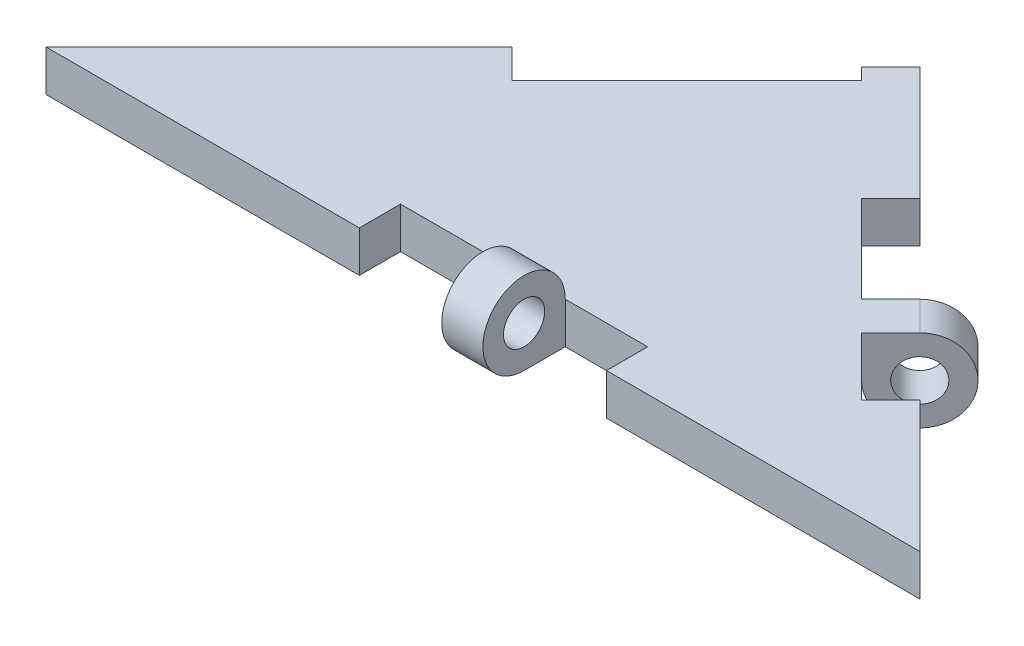
ISO-10303-21;
HEADER;
FILE_DESCRIPTION(('STEP AP214'),'2;1');
FILE_NAME('part.step','',(''),(''),'','','');
FILE_SCHEMA(('AUTOMOTIVE_DESIGN { 1 0 10303 214 1 1 1 1 }'));
ENDSEC;
DATA;
#1=APPLICATION_CONTEXT('core data for automotive mechanical design processes');
#2=APPLICATION_PROTOCOL_DEFINITION('international standard','automotive_design',2000,#1);
#3=PRODUCT_CONTEXT('',#1,'mechanical');
#4=PRODUCT('Part','Part','',(#3));
#5=PRODUCT_RELATED_PRODUCT_CATEGORY('part','',(#4));
#6=PRODUCT_DEFINITION_FORMATION('','',#4);
#7=PRODUCT_DEFINITION_CONTEXT('part definition',#1,'design');
#8=PRODUCT_DEFINITION('design','',#6,#7);
#9=PRODUCT_DEFINITION_SHAPE('','',#8);
#10=(LENGTH_UNIT() NAMED_UNIT(*) SI_UNIT(.MILLI.,.METRE.));
#11=(NAMED_UNIT(*) PLANE_ANGLE_UNIT() SI_UNIT($,.RADIAN.));
#12=(NAMED_UNIT(*) SI_UNIT($,.STERADIAN.) SOLID_ANGLE_UNIT());
#13=UNCERTAINTY_MEASURE_WITH_UNIT(LENGTH_MEASURE(1.E-05),#10,'distance_accuracy_value','');
#14=(GEOMETRIC_REPRESENTATION_CONTEXT(3) GLOBAL_UNCERTAINTY_ASSIGNED_CONTEXT((#13)) GLOBAL_UNIT_ASSIGNED_CONTEXT((#10,
#11,#12)) REPRESENTATION_CONTEXT('',''));
#15=CARTESIAN_POINT('',(0.,0.,0.));
#16=DIRECTION('',(0.,0.,1.));
#17=DIRECTION('',(1.,0.,0.));
#18=AXIS2_PLACEMENT_3D('',#15,#16,#17);
#19=CARTESIAN_POINT('',(12.3743686707646,5.,-33.587572106361));
#20=DIRECTION('',(-0.707106781186548,0.,0.707106781186548));
#21=DIRECTION('',(0.707106781186548,0.,0.707106781186548));
#22=AXIS2_PLACEMENT_3D('',#19,#20,#21);
#23=PLANE('',#22);
#24=DIRECTION('',(0.,1.,0.));
#25=VECTOR('',#24,1.);
#26=CARTESIAN_POINT('',(26.5165042944955,0.,-19.4454364826301));
#27=LINE('',#26,#25);
#28=CARTESIAN_POINT('',(26.5165042944955,0.,-19.4454364826301));
#29=VERTEX_POINT('',#28);
#30=CARTESIAN_POINT('',(26.5165042944955,5.,-19.4454364826301));
#31=VERTEX_POINT('',#30);
#32=EDGE_CURVE('E664',#29,#31,#27,.T.);
#33=ORIENTED_EDGE('',*,*,#32,.T.);
#34=DIRECTION('',(-0.707106781186547,0.,-0.707106781186547));
#35=VECTOR('',#34,1.);
#36=CARTESIAN_POINT('',(12.3743686707646,5.,-33.587572106361));
#37=LINE('',#36,#35);
#38=CARTESIAN_POINT('',(33.587572106361,5.,-12.3743686707646));
#39=VERTEX_POINT('',#38);
#40=EDGE_CURVE('E287',#39,#31,#37,.T.);
#41=ORIENTED_EDGE('',*,*,#40,.F.);
#42=DIRECTION('',(0.,-1.,0.));
#43=VECTOR('',#42,1.);
#44=CARTESIAN_POINT('',(33.587572106361,5.,-12.3743686707646));
#45=LINE('',#44,#43);
#46=CARTESIAN_POINT('',(33.587572106361,0.,-12.3743686707646));
#47=VERTEX_POINT('',#46);
#48=EDGE_CURVE('E298',#39,#47,#45,.T.);
#49=ORIENTED_EDGE('',*,*,#48,.T.);
#50=DIRECTION('',(-0.707106781186547,0.,-0.707106781186547));
#51=VECTOR('',#50,1.);
#52=CARTESIAN_POINT('',(12.3743686707646,0.,-33.587572106361));
#53=LINE('',#52,#51);
#54=EDGE_CURVE('E278',#47,#29,#53,.T.);
#55=ORIENTED_EDGE('',*,*,#54,.T.);
#56=EDGE_LOOP('',(#33,#41,#49,#55));
#57=FACE_BOUND('',#56,.T.);
#58=ADVANCED_FACE('F34',(#57),#23,.F.);
#59=CARTESIAN_POINT('',(-15.,0.,-5.00000000000001));
#60=DIRECTION('',(0.,0.,-1.));
#61=DIRECTION('',(-1.,0.,0.));
#62=AXIS2_PLACEMENT_3D('',#59,#60,#61);
#63=PLANE('',#62);
#64=DIRECTION('',(0.,-1.,0.));
#65=VECTOR('',#64,1.);
#66=CARTESIAN_POINT('',(5.,0.,-5.));
#67=LINE('',#66,#65);
#68=CARTESIAN_POINT('',(5.,5.,-5.));
#69=VERTEX_POINT('',#68);
#70=CARTESIAN_POINT('',(5.,0.,-5.00000000000001));
#71=VERTEX_POINT('',#70);
#72=EDGE_CURVE('E388',#69,#71,#67,.T.);
#73=ORIENTED_EDGE('',*,*,#72,.T.);
#74=DIRECTION('',(-1.,0.,0.));
#75=VECTOR('',#74,1.);
#76=CARTESIAN_POINT('',(-15.,0.,-5.00000000000001));
#77=LINE('',#76,#75);
#78=CARTESIAN_POINT('',(15.,0.,-5.00000000000001));
#79=VERTEX_POINT('',#78);
#80=EDGE_CURVE('E244',#79,#71,#77,.T.);
#81=ORIENTED_EDGE('',*,*,#80,.F.);
#82=DIRECTION('',(0.,1.,0.));
#83=VECTOR('',#82,1.);
#84=CARTESIAN_POINT('',(15.,0.,-5.00000000000001));
#85=LINE('',#84,#83);
#86=CARTESIAN_POINT('',(15.,5.,-5.00000000000001));
#87=VERTEX_POINT('',#86);
#88=EDGE_CURVE('E255',#79,#87,#85,.T.);
#89=ORIENTED_EDGE('',*,*,#88,.T.);
#90=DIRECTION('',(-1.,0.,0.));
#91=VECTOR('',#90,1.);
#92=CARTESIAN_POINT('',(-15.,5.,-5.00000000000001));
#93=LINE('',#92,#91);
#94=EDGE_CURVE('E235',#87,#69,#93,.T.);
#95=ORIENTED_EDGE('',*,*,#94,.T.);
#96=EDGE_LOOP('',(#73,#81,#89,#95));
#97=FACE_BOUND('',#96,.T.);
#98=ADVANCED_FACE('F339',(#97),#63,.F.);
#99=CARTESIAN_POINT('',(0.,5.,-53.0330085889911));
#100=DIRECTION('',(-0.707106781186548,0.,0.707106781186547));
#101=DIRECTION('',(0.707106781186547,0.,0.707106781186548));
#102=AXIS2_PLACEMENT_3D('',#99,#100,#101);
#103=PLANE('',#102);
#104=DIRECTION('',(-0.707106781186547,0.,-0.707106781186548));
#105=VECTOR('',#104,1.);
#106=CARTESIAN_POINT('',(0.,0.,-53.0330085889911));
#107=LINE('',#106,#105);
#108=CARTESIAN_POINT('',(15.9099025766973,0.,-37.1231060122938));
#109=VERTEX_POINT('',#108);
#110=CARTESIAN_POINT('',(2.12132034355964,0.,-50.9116882454314));
#111=VERTEX_POINT('',#110);
#112=EDGE_CURVE('E188',#109,#111,#107,.T.);
#113=ORIENTED_EDGE('',*,*,#112,.T.);
#114=DIRECTION('',(0.,-1.,0.));
#115=VECTOR('',#114,1.);
#116=CARTESIAN_POINT('',(2.12132034355964,10.,-50.9116882454314));
#117=LINE('',#116,#115);
#118=CARTESIAN_POINT('',(2.12132034355964,5.,-50.9116882454314));
#119=VERTEX_POINT('',#118);
#120=EDGE_CURVE('E174',#119,#111,#117,.T.);
#121=ORIENTED_EDGE('',*,*,#120,.F.);
#122=DIRECTION('',(-0.707106781186547,0.,-0.707106781186548));
#123=VECTOR('',#122,1.);
#124=CARTESIAN_POINT('',(0.,5.,-53.0330085889911));
#125=LINE('',#124,#123);
#126=CARTESIAN_POINT('',(15.9099025766973,5.,-37.1231060122938));
#127=VERTEX_POINT('',#126);
#128=EDGE_CURVE('E263',#127,#119,#125,.T.);
#129=ORIENTED_EDGE('',*,*,#128,.F.);
#130=DIRECTION('',(0.,-1.,0.));
#131=VECTOR('',#130,1.);
#132=CARTESIAN_POINT('',(15.9099025766973,5.,-37.1231060122938));
#133=LINE('',#132,#131);
#134=EDGE_CURVE('E195',#127,#109,#133,.T.);
#135=ORIENTED_EDGE('',*,*,#134,.T.);
#136=EDGE_LOOP('',(#113,#121,#129,#135));
#137=FACE_BOUND('',#136,.T.);
#138=ADVANCED_FACE('F194',(#137),#103,.F.);
#139=CARTESIAN_POINT('',(-53.0330085889911,5.,0.));
#140=DIRECTION('',(0.,0.,-1.));
#141=DIRECTION('',(-1.,0.,0.));
#142=AXIS2_PLACEMENT_3D('',#139,#140,#141);
#143=PLANE('',#142);
#144=DIRECTION('',(1.,0.,0.));
#145=VECTOR('',#144,1.);
#146=CARTESIAN_POINT('',(-53.0330085889911,0.,0.));
#147=LINE('',#146,#145);
#148=CARTESIAN_POINT('',(-53.0330085889911,0.,0.));
#149=VERTEX_POINT('',#148);
#150=CARTESIAN_POINT('',(-15.,0.,0.));
#151=VERTEX_POINT('',#150);
#152=EDGE_CURVE('E197',#149,#151,#147,.T.);
#153=ORIENTED_EDGE('',*,*,#152,.T.);
#154=DIRECTION('',(0.,1.,0.));
#155=VECTOR('',#154,1.);
#156=CARTESIAN_POINT('',(-15.,0.,0.));
#157=LINE('',#156,#155);
#158=CARTESIAN_POINT('',(-15.,5.,0.));
#159=VERTEX_POINT('',#158);
#160=EDGE_CURVE('E247',#151,#159,#157,.T.);
#161=ORIENTED_EDGE('',*,*,#160,.T.);
#162=DIRECTION('',(1.,0.,0.));
#163=VECTOR('',#162,1.);
#164=CARTESIAN_POINT('',(-53.0330085889911,5.,0.));
#165=LINE('',#164,#163);
#166=CARTESIAN_POINT('',(-53.0330085889911,5.,0.));
#167=VERTEX_POINT('',#166);
#168=EDGE_CURVE('E217',#167,#159,#165,.T.);
#169=ORIENTED_EDGE('',*,*,#168,.F.);
#170=DIRECTION('',(0.,-1.,0.));
#171=VECTOR('',#170,1.);
#172=CARTESIAN_POINT('',(-53.0330085889911,5.,0.));
#173=LINE('',#172,#171);
#174=EDGE_CURVE('E42',#167,#149,#173,.T.);
#175=ORIENTED_EDGE('',*,*,#174,.T.);
#176=EDGE_LOOP('',(#153,#161,#169,#175));
#177=FACE_BOUND('',#176,.T.);
#178=ADVANCED_FACE('F213',(#177),#143,.F.);
#179=CARTESIAN_POINT('',(-53.0330085889911,5.,0.));
#180=DIRECTION('',(0.707106781186548,0.,0.707106781186547));
#181=DIRECTION('',(0.707106781186547,0.,-0.707106781186548));
#182=AXIS2_PLACEMENT_3D('',#179,#180,#181);
#183=PLANE('',#182);
#184=DIRECTION('',(-0.707106781186547,0.,0.707106781186548));
#185=VECTOR('',#184,1.);
#186=CARTESIAN_POINT('',(-53.0330085889911,5.,0.));
#187=LINE('',#186,#185);
#188=CARTESIAN_POINT('',(-24.7487373415292,5.,-28.2842712474619));
#189=VERTEX_POINT('',#188);
#190=EDGE_CURVE('E200',#189,#167,#187,.T.);
#191=ORIENTED_EDGE('',*,*,#190,.F.);
#192=DIRECTION('',(0.,1.,0.));
#193=VECTOR('',#192,1.);
#194=CARTESIAN_POINT('',(-24.7487373415292,0.,-28.2842712474619));
#195=LINE('',#194,#193);
#196=CARTESIAN_POINT('',(-24.7487373415292,0.,-28.2842712474619));
#197=VERTEX_POINT('',#196);
#198=EDGE_CURVE('E223',#197,#189,#195,.T.);
#199=ORIENTED_EDGE('',*,*,#198,.F.);
#200=DIRECTION('',(-0.707106781186547,0.,0.707106781186548));
#201=VECTOR('',#200,1.);
#202=CARTESIAN_POINT('',(-53.0330085889911,0.,0.));
#203=LINE('',#202,#201);
#204=EDGE_CURVE('E222',#197,#149,#203,.T.);
#205=ORIENTED_EDGE('',*,*,#204,.T.);
#206=ORIENTED_EDGE('',*,*,#174,.F.);
#207=EDGE_LOOP('',(#191,#199,#205,#206));
#208=FACE_BOUND('',#207,.T.);
#209=ADVANCED_FACE('F36',(#208),#183,.F.);
#210=CARTESIAN_POINT('',(15.,5.,0.));
#211=VERTEX_POINT('',#210);
#212=CARTESIAN_POINT('',(53.0330085889911,5.,0.));
#213=VERTEX_POINT('',#212);
#214=EDGE_CURVE('E261',#211,#213,#165,.T.);
#215=ORIENTED_EDGE('',*,*,#214,.F.);
#216=DIRECTION('',(0.,1.,0.));
#217=VECTOR('',#216,1.);
#218=CARTESIAN_POINT('',(15.,0.,0.));
#219=LINE('',#218,#217);
#220=CARTESIAN_POINT('',(15.,0.,0.));
#221=VERTEX_POINT('',#220);
#222=EDGE_CURVE('E257',#221,#211,#219,.T.);
#223=ORIENTED_EDGE('',*,*,#222,.F.);
#224=CARTESIAN_POINT('',(53.0330085889911,0.,0.));
#225=VERTEX_POINT('',#224);
#226=EDGE_CURVE('E202',#221,#225,#147,.T.);
#227=ORIENTED_EDGE('',*,*,#226,.T.);
#228=DIRECTION('',(0.,-1.,0.));
#229=VECTOR('',#228,1.);
#230=CARTESIAN_POINT('',(53.0330085889911,5.,0.));
#231=LINE('',#230,#229);
#232=EDGE_CURVE('E206',#213,#225,#231,.T.);
#233=ORIENTED_EDGE('',*,*,#232,.F.);
#234=EDGE_LOOP('',(#215,#223,#227,#233));
#235=FACE_BOUND('',#234,.T.);
#236=ADVANCED_FACE('F532',(#235),#143,.F.);
#237=CARTESIAN_POINT('',(37.1231060122937,0.,-15.9099025766973));
#238=VERTEX_POINT('',#237);
#239=EDGE_CURVE('E196',#225,#238,#107,.T.);
#240=ORIENTED_EDGE('',*,*,#239,.T.);
#241=DIRECTION('',(0.,-1.,0.));
#242=VECTOR('',#241,1.);
#243=CARTESIAN_POINT('',(37.1231060122938,5.,-15.9099025766973));
#244=LINE('',#243,#242);
#245=CARTESIAN_POINT('',(37.1231060122938,5.,-15.9099025766973));
#246=VERTEX_POINT('',#245);
#247=EDGE_CURVE('E300',#246,#238,#244,.T.);
#248=ORIENTED_EDGE('',*,*,#247,.F.);
#249=EDGE_CURVE('E208',#213,#246,#125,.T.);
#250=ORIENTED_EDGE('',*,*,#249,.F.);
#251=ORIENTED_EDGE('',*,*,#232,.T.);
#252=EDGE_LOOP('',(#240,#248,#250,#251));
#253=FACE_BOUND('',#252,.T.);
#254=ADVANCED_FACE('F527',(#253),#103,.F.);
#255=CARTESIAN_POINT('',(0.,5.,0.));
#256=DIRECTION('',(0.,-1.,0.));
#257=DIRECTION('',(0.,0.,-1.));
#258=AXIS2_PLACEMENT_3D('',#255,#256,#257);
#259=PLANE('',#258);
#260=ORIENTED_EDGE('',*,*,#128,.T.);
#261=DIRECTION('',(-0.707106781186548,0.,0.707106781186547));
#262=VECTOR('',#261,1.);
#263=CARTESIAN_POINT('',(-24.3951839509359,5.,-24.3951839509359));
#264=LINE('',#263,#262);
#265=CARTESIAN_POINT('',(-1.41421356237311,5.,-47.3761543394987));
#266=VERTEX_POINT('',#265);
#267=EDGE_CURVE('E177',#119,#266,#264,.T.);
#268=ORIENTED_EDGE('',*,*,#267,.T.);
#269=DIRECTION('',(-0.707106781186548,0.,-0.707106781186547));
#270=VECTOR('',#269,1.);
#271=CARTESIAN_POINT('',(-3.53553390593276,5.,-49.4974746830583));
#272=LINE('',#271,#270);
#273=CARTESIAN_POINT('',(0.,5.,-45.9619407771256));
#274=VERTEX_POINT('',#273);
#275=EDGE_CURVE('E297',#274,#266,#272,.T.);
#276=ORIENTED_EDGE('',*,*,#275,.F.);
#277=DIRECTION('',(0.707106781186547,0.,-0.707106781186547));
#278=VECTOR('',#277,1.);
#279=CARTESIAN_POINT('',(0.,5.,-45.9619407771256));
#280=LINE('',#279,#278);
#281=CARTESIAN_POINT('',(-21.2132034355964,5.,-24.7487373415292));
#282=VERTEX_POINT('',#281);
#283=EDGE_CURVE('E305',#282,#274,#280,.T.);
#284=ORIENTED_EDGE('',*,*,#283,.F.);
#285=DIRECTION('',(0.707106781186548,0.,0.707106781186547));
#286=VECTOR('',#285,1.);
#287=CARTESIAN_POINT('',(-24.7487373415292,5.,-28.2842712474619));
#288=LINE('',#287,#286);
#289=EDGE_CURVE('E310',#189,#282,#288,.T.);
#290=ORIENTED_EDGE('',*,*,#289,.F.);
#291=ORIENTED_EDGE('',*,*,#190,.T.);
#292=ORIENTED_EDGE('',*,*,#168,.T.);
#293=DIRECTION('',(0.,0.,1.));
#294=VECTOR('',#293,1.);
#295=CARTESIAN_POINT('',(-15.,5.,0.));
#296=LINE('',#295,#294);
#297=CARTESIAN_POINT('',(-15.,5.,-5.00000000000001));
#298=VERTEX_POINT('',#297);
#299=EDGE_CURVE('E248',#298,#159,#296,.T.);
#300=ORIENTED_EDGE('',*,*,#299,.F.);
#301=CARTESIAN_POINT('',(0.,5.,-5.00000000000001));
#302=VERTEX_POINT('',#301);
#303=EDGE_CURVE('E239',#302,#298,#93,.T.);
#304=ORIENTED_EDGE('',*,*,#303,.F.);
#305=DIRECTION('',(1.,0.,0.));
#306=VECTOR('',#305,1.);
#307=CARTESIAN_POINT('',(0.,5.,-5.));
#308=LINE('',#307,#306);
#309=EDGE_CURVE('E284',#302,#69,#308,.T.);
#310=ORIENTED_EDGE('',*,*,#309,.T.);
#311=ORIENTED_EDGE('',*,*,#94,.F.);
#312=DIRECTION('',(0.,0.,-1.));
#313=VECTOR('',#312,1.);
#314=CARTESIAN_POINT('',(15.,5.,0.));
#315=LINE('',#314,#313);
#316=EDGE_CURVE('E250',#211,#87,#315,.T.);
#317=ORIENTED_EDGE('',*,*,#316,.F.);
#318=ORIENTED_EDGE('',*,*,#214,.T.);
#319=ORIENTED_EDGE('',*,*,#249,.T.);
#320=DIRECTION('',(-0.707106781186549,0.,0.707106781186546));
#321=VECTOR('',#320,1.);
#322=CARTESIAN_POINT('',(37.1231060122938,5.,-15.9099025766973));
#323=LINE('',#322,#321);
#324=EDGE_CURVE('E277',#246,#39,#323,.T.);
#325=ORIENTED_EDGE('',*,*,#324,.T.);
#326=ORIENTED_EDGE('',*,*,#40,.T.);
#327=DIRECTION('',(0.707106781186548,0.,-0.707106781186547));
#328=VECTOR('',#327,1.);
#329=CARTESIAN_POINT('',(3.53553390593269,5.,3.53553390593269));
#330=LINE('',#329,#328);
#331=CARTESIAN_POINT('',(30.0520382004283,5.,-22.9809703885629));
#332=VERTEX_POINT('',#331);
#333=EDGE_CURVE('E666',#31,#332,#330,.T.);
#334=ORIENTED_EDGE('',*,*,#333,.T.);
#335=DIRECTION('',(0.707106781186547,0.,0.707106781186548));
#336=VECTOR('',#335,1.);
#337=CARTESIAN_POINT('',(26.5165042944955,5.,-26.5165042944956));
#338=LINE('',#337,#336);
#339=CARTESIAN_POINT('',(26.5165042944955,5.,-26.5165042944956));
#340=VERTEX_POINT('',#339);
#341=EDGE_CURVE('E385',#340,#332,#338,.T.);
#342=ORIENTED_EDGE('',*,*,#341,.F.);
#343=DIRECTION('',(0.707106781186548,0.,-0.707106781186547));
#344=VECTOR('',#343,1.);
#345=CARTESIAN_POINT('',(0.,5.,0.));
#346=LINE('',#345,#344);
#347=CARTESIAN_POINT('',(22.9809703885628,5.,-22.9809703885629));
#348=VERTEX_POINT('',#347);
#349=EDGE_CURVE('E374',#348,#340,#346,.T.);
#350=ORIENTED_EDGE('',*,*,#349,.F.);
#351=CARTESIAN_POINT('',(12.3743686707646,5.,-33.587572106361));
#352=VERTEX_POINT('',#351);
#353=EDGE_CURVE('E56',#348,#352,#37,.T.);
#354=ORIENTED_EDGE('',*,*,#353,.T.);
#355=DIRECTION('',(0.707106781186548,0.,-0.707106781186547));
#356=VECTOR('',#355,1.);
#357=CARTESIAN_POINT('',(15.9099025766973,5.,-37.1231060122938));
#358=LINE('',#357,#356);
#359=EDGE_CURVE('E273',#352,#127,#358,.T.);
#360=ORIENTED_EDGE('',*,*,#359,.T.);
#361=EDGE_LOOP('',(#260,#268,#276,#284,#290,#291,#292,#300,#304,#310,#311,#317,#318,#319,#325,
#326,#334,#342,#350,#354,#360));
#362=FACE_BOUND('',#361,.T.);
#363=ADVANCED_FACE('F269',(#362),#259,.F.);
#364=CARTESIAN_POINT('',(0.,0.,0.));
#365=DIRECTION('',(0.,-1.,0.));
#366=DIRECTION('',(0.,0.,-1.));
#367=AXIS2_PLACEMENT_3D('',#364,#365,#366);
#368=PLANE('',#367);
#369=DIRECTION('',(-0.707106781186548,0.,0.707106781186547));
#370=VECTOR('',#369,1.);
#371=CARTESIAN_POINT('',(2.12132034355964,0.,-50.9116882454314));
#372=LINE('',#371,#370);
#373=CARTESIAN_POINT('',(-1.41421356237311,0.,-47.3761543394987));
#374=VERTEX_POINT('',#373);
#375=EDGE_CURVE('E49',#111,#374,#372,.T.);
#376=ORIENTED_EDGE('',*,*,#375,.F.);
#377=ORIENTED_EDGE('',*,*,#112,.F.);
#378=DIRECTION('',(0.707106781186548,0.,-0.707106781186547));
#379=VECTOR('',#378,1.);
#380=CARTESIAN_POINT('',(15.9099025766973,0.,-37.1231060122938));
#381=LINE('',#380,#379);
#382=CARTESIAN_POINT('',(12.3743686707646,0.,-33.587572106361));
#383=VERTEX_POINT('',#382);
#384=EDGE_CURVE('E290',#383,#109,#381,.T.);
#385=ORIENTED_EDGE('',*,*,#384,.F.);
#386=CARTESIAN_POINT('',(22.9809703885628,0.,-22.9809703885629));
#387=VERTEX_POINT('',#386);
#388=EDGE_CURVE('E281',#387,#383,#53,.T.);
#389=ORIENTED_EDGE('',*,*,#388,.F.);
#390=DIRECTION('',(0.707106781186547,0.,0.707106781186548));
#391=VECTOR('',#390,1.);
#392=CARTESIAN_POINT('',(22.9809703885628,0.,-22.9809703885629));
#393=LINE('',#392,#391);
#394=EDGE_CURVE('E367',#387,#29,#393,.T.);
#395=ORIENTED_EDGE('',*,*,#394,.T.);
#396=ORIENTED_EDGE('',*,*,#54,.F.);
#397=DIRECTION('',(-0.707106781186549,0.,0.707106781186546));
#398=VECTOR('',#397,1.);
#399=CARTESIAN_POINT('',(37.1231060122938,0.,-15.9099025766973));
#400=LINE('',#399,#398);
#401=EDGE_CURVE('E292',#238,#47,#400,.T.);
#402=ORIENTED_EDGE('',*,*,#401,.F.);
#403=ORIENTED_EDGE('',*,*,#239,.F.);
#404=ORIENTED_EDGE('',*,*,#226,.F.);
#405=DIRECTION('',(0.,0.,-1.));
#406=VECTOR('',#405,1.);
#407=CARTESIAN_POINT('',(15.,0.,0.));
#408=LINE('',#407,#406);
#409=EDGE_CURVE('E234',#221,#79,#408,.T.);
#410=ORIENTED_EDGE('',*,*,#409,.T.);
#411=ORIENTED_EDGE('',*,*,#80,.T.);
#412=DIRECTION('',(0.,0.,1.));
#413=VECTOR('',#412,1.);
#414=CARTESIAN_POINT('',(5.,0.,0.));
#415=LINE('',#414,#413);
#416=CARTESIAN_POINT('',(5.,0.,0.));
#417=VERTEX_POINT('',#416);
#418=EDGE_CURVE('E407',#71,#417,#415,.T.);
#419=ORIENTED_EDGE('',*,*,#418,.T.);
#420=DIRECTION('',(1.,0.,0.));
#421=VECTOR('',#420,1.);
#422=CARTESIAN_POINT('',(0.,0.,0.));
#423=LINE('',#422,#421);
#424=CARTESIAN_POINT('',(0.,0.,0.));
#425=VERTEX_POINT('',#424);
#426=EDGE_CURVE('E404',#425,#417,#423,.T.);
#427=ORIENTED_EDGE('',*,*,#426,.F.);
#428=DIRECTION('',(0.,0.,1.));
#429=VECTOR('',#428,1.);
#430=CARTESIAN_POINT('',(0.,0.,0.));
#431=LINE('',#430,#429);
#432=CARTESIAN_POINT('',(0.,0.,-5.00000000000001));
#433=VERTEX_POINT('',#432);
#434=EDGE_CURVE('E400',#433,#425,#431,.T.);
#435=ORIENTED_EDGE('',*,*,#434,.F.);
#436=CARTESIAN_POINT('',(-15.,0.,-5.00000000000001));
#437=VERTEX_POINT('',#436);
#438=EDGE_CURVE('E230',#433,#437,#77,.T.);
#439=ORIENTED_EDGE('',*,*,#438,.T.);
#440=DIRECTION('',(0.,0.,1.));
#441=VECTOR('',#440,1.);
#442=CARTESIAN_POINT('',(-15.,0.,0.));
#443=LINE('',#442,#441);
#444=EDGE_CURVE('E228',#437,#151,#443,.T.);
#445=ORIENTED_EDGE('',*,*,#444,.T.);
#446=ORIENTED_EDGE('',*,*,#152,.F.);
#447=ORIENTED_EDGE('',*,*,#204,.F.);
#448=DIRECTION('',(0.707106781186548,0.,0.707106781186547));
#449=VECTOR('',#448,1.);
#450=CARTESIAN_POINT('',(-24.7487373415292,0.,-28.2842712474619));
#451=LINE('',#450,#449);
#452=CARTESIAN_POINT('',(-21.2132034355964,0.,-24.7487373415292));
#453=VERTEX_POINT('',#452);
#454=EDGE_CURVE('E304',#197,#453,#451,.T.);
#455=ORIENTED_EDGE('',*,*,#454,.T.);
#456=DIRECTION('',(0.707106781186547,0.,-0.707106781186547));
#457=VECTOR('',#456,1.);
#458=CARTESIAN_POINT('',(0.,0.,-45.9619407771256));
#459=LINE('',#458,#457);
#460=CARTESIAN_POINT('',(0.,0.,-45.9619407771256));
#461=VERTEX_POINT('',#460);
#462=EDGE_CURVE('E307',#453,#461,#459,.T.);
#463=ORIENTED_EDGE('',*,*,#462,.T.);
#464=DIRECTION('',(-0.707106781186548,0.,-0.707106781186547));
#465=VECTOR('',#464,1.);
#466=CARTESIAN_POINT('',(-3.53553390593276,0.,-49.4974746830583));
#467=LINE('',#466,#465);
#468=EDGE_CURVE('E191',#461,#374,#467,.T.);
#469=ORIENTED_EDGE('',*,*,#468,.T.);
#470=EDGE_LOOP('',(#376,#377,#385,#389,#395,#396,#402,#403,#404,#410,#411,#419,#427,#435,#439,
#445,#446,#447,#455,#463,#469));
#471=FACE_BOUND('',#470,.T.);
#472=ADVANCED_FACE('F186',(#471),#368,.T.);
#473=CARTESIAN_POINT('',(-15.,0.,0.));
#474=DIRECTION('',(-1.,0.,0.));
#475=DIRECTION('',(0.,0.,1.));
#476=AXIS2_PLACEMENT_3D('',#473,#474,#475);
#477=PLANE('',#476);
#478=ORIENTED_EDGE('',*,*,#299,.T.);
#479=ORIENTED_EDGE('',*,*,#160,.F.);
#480=ORIENTED_EDGE('',*,*,#444,.F.);
#481=DIRECTION('',(0.,1.,0.));
#482=VECTOR('',#481,1.);
#483=CARTESIAN_POINT('',(-15.,0.,-5.00000000000001));
#484=LINE('',#483,#482);
#485=EDGE_CURVE('E225',#437,#298,#484,.T.);
#486=ORIENTED_EDGE('',*,*,#485,.T.);
#487=EDGE_LOOP('',(#478,#479,#480,#486));
#488=FACE_BOUND('',#487,.T.);
#489=ADVANCED_FACE('F500',(#488),#477,.F.);
#490=ORIENTED_EDGE('',*,*,#438,.F.);
#491=DIRECTION('',(0.,-1.,0.));
#492=VECTOR('',#491,1.);
#493=CARTESIAN_POINT('',(0.,0.,-5.));
#494=LINE('',#493,#492);
#495=EDGE_CURVE('E396',#302,#433,#494,.T.);
#496=ORIENTED_EDGE('',*,*,#495,.F.);
#497=ORIENTED_EDGE('',*,*,#303,.T.);
#498=ORIENTED_EDGE('',*,*,#485,.F.);
#499=EDGE_LOOP('',(#490,#496,#497,#498));
#500=FACE_BOUND('',#499,.T.);
#501=ADVANCED_FACE('F333',(#500),#63,.F.);
#502=CARTESIAN_POINT('',(15.,0.,0.));
#503=DIRECTION('',(1.,0.,0.));
#504=DIRECTION('',(0.,0.,-1.));
#505=AXIS2_PLACEMENT_3D('',#502,#503,#504);
#506=PLANE('',#505);
#507=ORIENTED_EDGE('',*,*,#316,.T.);
#508=ORIENTED_EDGE('',*,*,#88,.F.);
#509=ORIENTED_EDGE('',*,*,#409,.F.);
#510=ORIENTED_EDGE('',*,*,#222,.T.);
#511=EDGE_LOOP('',(#507,#508,#509,#510));
#512=FACE_BOUND('',#511,.T.);
#513=ADVANCED_FACE('F326',(#512),#506,.F.);
#514=CARTESIAN_POINT('',(-3.53553390593276,0.,-49.4974746830583));
#515=DIRECTION('',(0.707106781186547,0.,-0.707106781186548));
#516=DIRECTION('',(-0.707106781186548,0.,-0.707106781186547));
#517=AXIS2_PLACEMENT_3D('',#514,#515,#516);
#518=PLANE('',#517);
#519=ORIENTED_EDGE('',*,*,#275,.T.);
#520=DIRECTION('',(0.,-1.,0.));
#521=VECTOR('',#520,1.);
#522=CARTESIAN_POINT('',(-1.41421356237311,0.,-47.3761543394987));
#523=LINE('',#522,#521);
#524=EDGE_CURVE('E11',#266,#374,#523,.T.);
#525=ORIENTED_EDGE('',*,*,#524,.T.);
#526=ORIENTED_EDGE('',*,*,#468,.F.);
#527=DIRECTION('',(0.,1.,0.));
#528=VECTOR('',#527,1.);
#529=CARTESIAN_POINT('',(0.,0.,-45.9619407771256));
#530=LINE('',#529,#528);
#531=EDGE_CURVE('E251',#461,#274,#530,.T.);
#532=ORIENTED_EDGE('',*,*,#531,.T.);
#533=EDGE_LOOP('',(#519,#525,#526,#532));
#534=FACE_BOUND('',#533,.T.);
#535=ADVANCED_FACE('F324',(#534),#518,.F.);
#536=CARTESIAN_POINT('',(0.,0.,-45.9619407771256));
#537=DIRECTION('',(0.707106781186547,0.,0.707106781186548));
#538=DIRECTION('',(0.707106781186548,0.,-0.707106781186547));
#539=AXIS2_PLACEMENT_3D('',#536,#537,#538);
#540=PLANE('',#539);
#541=ORIENTED_EDGE('',*,*,#283,.T.);
#542=ORIENTED_EDGE('',*,*,#531,.F.);
#543=ORIENTED_EDGE('',*,*,#462,.F.);
#544=DIRECTION('',(0.,1.,0.));
#545=VECTOR('',#544,1.);
#546=CARTESIAN_POINT('',(-21.2132034355964,0.,-24.7487373415292));
#547=LINE('',#546,#545);
#548=EDGE_CURVE('E315',#453,#282,#547,.T.);
#549=ORIENTED_EDGE('',*,*,#548,.T.);
#550=EDGE_LOOP('',(#541,#542,#543,#549));
#551=FACE_BOUND('',#550,.T.);
#552=ADVANCED_FACE('F322',(#551),#540,.F.);
#553=CARTESIAN_POINT('',(-24.7487373415292,0.,-28.2842712474619));
#554=DIRECTION('',(-0.707106781186547,0.,0.707106781186548));
#555=DIRECTION('',(0.707106781186548,0.,0.707106781186547));
#556=AXIS2_PLACEMENT_3D('',#553,#554,#555);
#557=PLANE('',#556);
#558=ORIENTED_EDGE('',*,*,#289,.T.);
#559=ORIENTED_EDGE('',*,*,#548,.F.);
#560=ORIENTED_EDGE('',*,*,#454,.F.);
#561=ORIENTED_EDGE('',*,*,#198,.T.);
#562=EDGE_LOOP('',(#558,#559,#560,#561));
#563=FACE_BOUND('',#562,.T.);
#564=ADVANCED_FACE('F320',(#563),#557,.F.);
#565=CARTESIAN_POINT('',(15.9099025766973,5.,-37.1231060122938));
#566=DIRECTION('',(-0.707106781186547,0.,-0.707106781186548));
#567=DIRECTION('',(-0.707106781186548,0.,0.707106781186547));
#568=AXIS2_PLACEMENT_3D('',#565,#566,#567);
#569=PLANE('',#568);
#570=ORIENTED_EDGE('',*,*,#384,.T.);
#571=ORIENTED_EDGE('',*,*,#134,.F.);
#572=ORIENTED_EDGE('',*,*,#359,.F.);
#573=DIRECTION('',(0.,-1.,0.));
#574=VECTOR('',#573,1.);
#575=CARTESIAN_POINT('',(12.3743686707646,5.,-33.587572106361));
#576=LINE('',#575,#574);
#577=EDGE_CURVE('E295',#352,#383,#576,.T.);
#578=ORIENTED_EDGE('',*,*,#577,.T.);
#579=EDGE_LOOP('',(#570,#571,#572,#578));
#580=FACE_BOUND('',#579,.T.);
#581=ADVANCED_FACE('F351',(#580),#569,.F.);
#582=ORIENTED_EDGE('',*,*,#353,.F.);
#583=DIRECTION('',(0.,1.,0.));
#584=VECTOR('',#583,1.);
#585=CARTESIAN_POINT('',(22.9809703885628,0.,-22.9809703885629));
#586=LINE('',#585,#584);
#587=EDGE_CURVE('E373',#387,#348,#586,.T.);
#588=ORIENTED_EDGE('',*,*,#587,.F.);
#589=ORIENTED_EDGE('',*,*,#388,.T.);
#590=ORIENTED_EDGE('',*,*,#577,.F.);
#591=EDGE_LOOP('',(#582,#588,#589,#590));
#592=FACE_BOUND('',#591,.T.);
#593=ADVANCED_FACE('F342',(#592),#23,.F.);
#594=CARTESIAN_POINT('',(37.1231060122938,5.,-15.9099025766973));
#595=DIRECTION('',(0.707106781186546,0.,0.707106781186549));
#596=DIRECTION('',(0.707106781186549,0.,-0.707106781186546));
#597=AXIS2_PLACEMENT_3D('',#594,#595,#596);
#598=PLANE('',#597);
#599=ORIENTED_EDGE('',*,*,#401,.T.);
#600=ORIENTED_EDGE('',*,*,#48,.F.);
#601=ORIENTED_EDGE('',*,*,#324,.F.);
#602=ORIENTED_EDGE('',*,*,#247,.T.);
#603=EDGE_LOOP('',(#599,#600,#601,#602));
#604=FACE_BOUND('',#603,.T.);
#605=ADVANCED_FACE('F350',(#604),#598,.F.);
#606=CARTESIAN_POINT('',(0.,5.,0.));
#607=DIRECTION('',(1.,0.,0.));
#608=DIRECTION('',(0.,0.,-1.));
#609=AXIS2_PLACEMENT_3D('',#606,#607,#608);
#610=CYLINDRICAL_SURFACE('',#609,5.);
#611=CARTESIAN_POINT('',(5.,5.,0.));
#612=DIRECTION('',(-1.,0.,0.));
#613=DIRECTION('',(0.,0.,1.));
#614=AXIS2_PLACEMENT_3D('',#611,#612,#613);
#615=CIRCLE('',#614,5.);
#616=EDGE_CURVE('E384',#417,#69,#615,.T.);
#617=ORIENTED_EDGE('',*,*,#616,.T.);
#618=ORIENTED_EDGE('',*,*,#309,.F.);
#619=CARTESIAN_POINT('',(0.,5.,0.));
#620=DIRECTION('',(-1.,0.,0.));
#621=DIRECTION('',(0.,0.,1.));
#622=AXIS2_PLACEMENT_3D('',#619,#620,#621);
#623=CIRCLE('',#622,5.);
#624=EDGE_CURVE('E393',#425,#302,#623,.T.);
#625=ORIENTED_EDGE('',*,*,#624,.F.);
#626=ORIENTED_EDGE('',*,*,#426,.T.);
#627=EDGE_LOOP('',(#617,#618,#625,#626));
#628=FACE_BOUND('',#627,.T.);
#629=ADVANCED_FACE('F356',(#628),#610,.T.);
#630=CARTESIAN_POINT('',(0.,5.,0.));
#631=DIRECTION('',(1.,0.,0.));
#632=DIRECTION('',(0.,0.,-1.));
#633=AXIS2_PLACEMENT_3D('',#630,#631,#632);
#634=CYLINDRICAL_SURFACE('',#633,2.5);
#635=CARTESIAN_POINT('',(0.,5.,0.));
#636=DIRECTION('',(-1.,0.,0.));
#637=DIRECTION('',(0.,0.,1.));
#638=AXIS2_PLACEMENT_3D('',#635,#636,#637);
#639=CIRCLE('',#638,2.5);
#640=CARTESIAN_POINT('',(0.,5.,2.5));
#641=VERTEX_POINT('',#640);
#642=EDGE_CURVE('E402',#641,#641,#639,.T.);
#643=ORIENTED_EDGE('',*,*,#642,.T.);
#644=EDGE_LOOP('',(#643));
#645=FACE_BOUND('',#644,.T.);
#646=CARTESIAN_POINT('',(5.,5.,0.));
#647=DIRECTION('',(-1.,0.,0.));
#648=DIRECTION('',(0.,0.,1.));
#649=AXIS2_PLACEMENT_3D('',#646,#647,#648);
#650=CIRCLE('',#649,2.5);
#651=CARTESIAN_POINT('',(5.,5.,2.5));
#652=VERTEX_POINT('',#651);
#653=EDGE_CURVE('E397',#652,#652,#650,.T.);
#654=ORIENTED_EDGE('',*,*,#653,.F.);
#655=EDGE_LOOP('',(#654));
#656=FACE_BOUND('',#655,.T.);
#657=ADVANCED_FACE('F427',(#645,#656),#634,.F.);
#658=CARTESIAN_POINT('',(0.,0.,0.));
#659=DIRECTION('',(-1.,0.,0.));
#660=DIRECTION('',(0.,0.,1.));
#661=AXIS2_PLACEMENT_3D('',#658,#659,#660);
#662=PLANE('',#661);
#663=ORIENTED_EDGE('',*,*,#624,.T.);
#664=ORIENTED_EDGE('',*,*,#495,.T.);
#665=ORIENTED_EDGE('',*,*,#434,.T.);
#666=EDGE_LOOP('',(#663,#664,#665));
#667=FACE_BOUND('',#666,.T.);
#668=ORIENTED_EDGE('',*,*,#642,.F.);
#669=EDGE_LOOP('',(#668));
#670=FACE_BOUND('',#669,.T.);
#671=ADVANCED_FACE('F431',(#667,#670),#662,.T.);
#672=CARTESIAN_POINT('',(5.,0.,0.));
#673=DIRECTION('',(-1.,0.,0.));
#674=DIRECTION('',(0.,0.,1.));
#675=AXIS2_PLACEMENT_3D('',#672,#673,#674);
#676=PLANE('',#675);
#677=ORIENTED_EDGE('',*,*,#616,.F.);
#678=ORIENTED_EDGE('',*,*,#418,.F.);
#679=ORIENTED_EDGE('',*,*,#72,.F.);
#680=EDGE_LOOP('',(#677,#678,#679));
#681=FACE_BOUND('',#680,.T.);
#682=ORIENTED_EDGE('',*,*,#653,.T.);
#683=EDGE_LOOP('',(#682));
#684=FACE_BOUND('',#683,.T.);
#685=ADVANCED_FACE('F424',(#681,#684),#676,.F.);
#686=CARTESIAN_POINT('',(26.5165042944955,0.,-26.5165042944956));
#687=DIRECTION('',(0.707106781186547,0.,0.707106781186548));
#688=DIRECTION('',(0.707106781186548,0.,-0.707106781186547));
#689=AXIS2_PLACEMENT_3D('',#686,#687,#688);
#690=CYLINDRICAL_SURFACE('',#689,5.);
#691=CARTESIAN_POINT('',(30.0520382004282,0.,-22.9809703885628));
#692=DIRECTION('',(-0.707106781186547,0.,-0.707106781186548));
#693=DIRECTION('',(-0.707106781186548,0.,0.707106781186547));
#694=AXIS2_PLACEMENT_3D('',#691,#692,#693);
#695=CIRCLE('',#694,5.);
#696=EDGE_CURVE('E383',#332,#29,#695,.T.);
#697=ORIENTED_EDGE('',*,*,#696,.T.);
#698=ORIENTED_EDGE('',*,*,#394,.F.);
#699=CARTESIAN_POINT('',(26.5165042944955,0.,-26.5165042944956));
#700=DIRECTION('',(-0.707106781186547,0.,-0.707106781186548));
#701=DIRECTION('',(-0.707106781186548,0.,0.707106781186547));
#702=AXIS2_PLACEMENT_3D('',#699,#700,#701);
#703=CIRCLE('',#702,5.);
#704=EDGE_CURVE('E371',#340,#387,#703,.T.);
#705=ORIENTED_EDGE('',*,*,#704,.F.);
#706=ORIENTED_EDGE('',*,*,#341,.T.);
#707=EDGE_LOOP('',(#697,#698,#705,#706));
#708=FACE_BOUND('',#707,.T.);
#709=ADVANCED_FACE('F381',(#708),#690,.T.);
#710=CARTESIAN_POINT('',(26.5165042944955,0.,-26.5165042944956));
#711=DIRECTION('',(0.707106781186547,0.,0.707106781186548));
#712=DIRECTION('',(0.707106781186548,0.,-0.707106781186547));
#713=AXIS2_PLACEMENT_3D('',#710,#711,#712);
#714=CYLINDRICAL_SURFACE('',#713,2.5);
#715=CARTESIAN_POINT('',(26.5165042944955,0.,-26.5165042944956));
#716=DIRECTION('',(-0.707106781186547,0.,-0.707106781186548));
#717=DIRECTION('',(-0.707106781186548,0.,0.707106781186547));
#718=AXIS2_PLACEMENT_3D('',#715,#716,#717);
#719=CIRCLE('',#718,2.5);
#720=CARTESIAN_POINT('',(24.7487373415291,0.,-24.7487373415292));
#721=VERTEX_POINT('',#720);
#722=EDGE_CURVE('E378',#721,#721,#719,.T.);
#723=ORIENTED_EDGE('',*,*,#722,.T.);
#724=EDGE_LOOP('',(#723));
#725=FACE_BOUND('',#724,.T.);
#726=CARTESIAN_POINT('',(30.0520382004282,0.,-22.9809703885628));
#727=DIRECTION('',(-0.707106781186547,0.,-0.707106781186548));
#728=DIRECTION('',(-0.707106781186548,0.,0.707106781186547));
#729=AXIS2_PLACEMENT_3D('',#726,#727,#728);
#730=CIRCLE('',#729,2.5);
#731=CARTESIAN_POINT('',(28.2842712474619,0.,-21.2132034355964));
#732=VERTEX_POINT('',#731);
#733=EDGE_CURVE('E673',#732,#732,#730,.T.);
#734=ORIENTED_EDGE('',*,*,#733,.F.);
#735=EDGE_LOOP('',(#734));
#736=FACE_BOUND('',#735,.T.);
#737=ADVANCED_FACE('F440',(#725,#736),#714,.F.);
#738=CARTESIAN_POINT('',(0.,0.,0.));
#739=DIRECTION('',(-0.707106781186547,0.,-0.707106781186548));
#740=DIRECTION('',(-0.707106781186548,0.,0.707106781186547));
#741=AXIS2_PLACEMENT_3D('',#738,#739,#740);
#742=PLANE('',#741);
#743=ORIENTED_EDGE('',*,*,#722,.F.);
#744=EDGE_LOOP('',(#743));
#745=FACE_BOUND('',#744,.T.);
#746=ORIENTED_EDGE('',*,*,#704,.T.);
#747=ORIENTED_EDGE('',*,*,#587,.T.);
#748=ORIENTED_EDGE('',*,*,#349,.T.);
#749=EDGE_LOOP('',(#746,#747,#748));
#750=FACE_BOUND('',#749,.T.);
#751=ADVANCED_FACE('F372',(#745,#750),#742,.T.);
#752=CARTESIAN_POINT('',(3.53553390593269,0.,3.53553390593269));
#753=DIRECTION('',(-0.707106781186547,0.,-0.707106781186548));
#754=DIRECTION('',(-0.707106781186548,0.,0.707106781186547));
#755=AXIS2_PLACEMENT_3D('',#752,#753,#754);
#756=PLANE('',#755);
#757=ORIENTED_EDGE('',*,*,#733,.T.);
#758=EDGE_LOOP('',(#757));
#759=FACE_BOUND('',#758,.T.);
#760=ORIENTED_EDGE('',*,*,#696,.F.);
#761=ORIENTED_EDGE('',*,*,#333,.F.);
#762=ORIENTED_EDGE('',*,*,#32,.F.);
#763=EDGE_LOOP('',(#760,#761,#762));
#764=FACE_BOUND('',#763,.T.);
#765=ADVANCED_FACE('F446',(#759,#764),#756,.F.);
#766=CARTESIAN_POINT('',(2.12132034355964,10.,-50.9116882454314));
#767=DIRECTION('',(0.707106781186547,0.,0.707106781186548));
#768=DIRECTION('',(0.707106781186548,0.,-0.707106781186547));
#769=AXIS2_PLACEMENT_3D('',#766,#767,#768);
#770=PLANE('',#769);
#771=ORIENTED_EDGE('',*,*,#120,.T.);
#772=ORIENTED_EDGE('',*,*,#375,.T.);
#773=ORIENTED_EDGE('',*,*,#524,.F.);
#774=ORIENTED_EDGE('',*,*,#267,.F.);
#775=EDGE_LOOP('',(#771,#772,#773,#774));
#776=FACE_BOUND('',#775,.T.);
#777=ADVANCED_FACE('F175',(#776),#770,.F.);
#778=CLOSED_SHELL('',(#58,#98,#138,#178,#209,#236,#254,#363,#472,#489,#501,#513,#535,#552,#564,
#581,#593,#605,#629,#657,#671,#685,#709,#737,#751,#765,#777));
#779=MANIFOLD_SOLID_BREP('B2',#778);
#780=ADVANCED_BREP_SHAPE_REPRESENTATION('',(#18,#779),#14);
#781=SHAPE_DEFINITION_REPRESENTATION(#9,#780);
ENDSEC;
END-ISO-10303-21;
